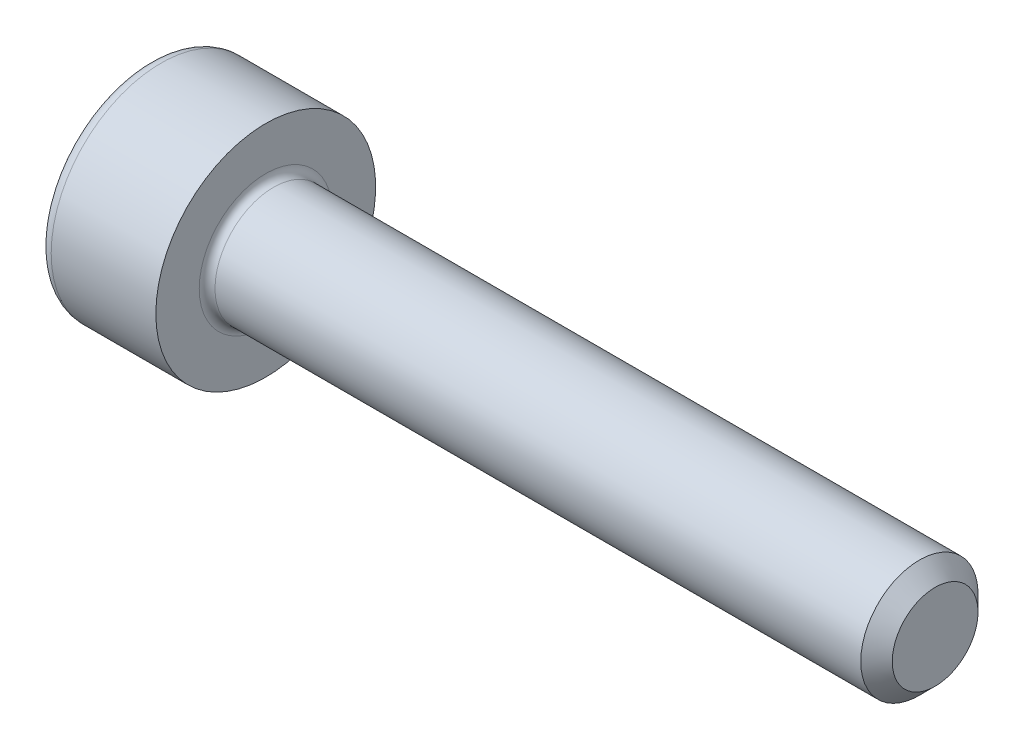
ISO-10303-21;
HEADER;
FILE_DESCRIPTION(('STEP AP214'),'2;1');
FILE_NAME('part.step','',(''),(''),'','','');
FILE_SCHEMA(('AUTOMOTIVE_DESIGN { 1 0 10303 214 1 1 1 1 }'));
ENDSEC;
DATA;
#1=APPLICATION_CONTEXT('core data for automotive mechanical design processes');
#2=APPLICATION_PROTOCOL_DEFINITION('international standard','automotive_design',2000,#1);
#3=PRODUCT_CONTEXT('',#1,'mechanical');
#4=PRODUCT('Part','Part','',(#3));
#5=PRODUCT_RELATED_PRODUCT_CATEGORY('part','',(#4));
#6=PRODUCT_DEFINITION_FORMATION('','',#4);
#7=PRODUCT_DEFINITION_CONTEXT('part definition',#1,'design');
#8=PRODUCT_DEFINITION('design','',#6,#7);
#9=PRODUCT_DEFINITION_SHAPE('','',#8);
#10=(LENGTH_UNIT() NAMED_UNIT(*) SI_UNIT(.MILLI.,.METRE.));
#11=(NAMED_UNIT(*) PLANE_ANGLE_UNIT() SI_UNIT($,.RADIAN.));
#12=(NAMED_UNIT(*) SI_UNIT($,.STERADIAN.) SOLID_ANGLE_UNIT());
#13=UNCERTAINTY_MEASURE_WITH_UNIT(LENGTH_MEASURE(1.E-05),#10,'distance_accuracy_value','');
#14=(GEOMETRIC_REPRESENTATION_CONTEXT(3) GLOBAL_UNCERTAINTY_ASSIGNED_CONTEXT((#13)) GLOBAL_UNIT_ASSIGNED_CONTEXT((#10,
#11,#12)) REPRESENTATION_CONTEXT('',''));
#15=CARTESIAN_POINT('',(0.,0.,0.));
#16=DIRECTION('',(0.,0.,1.));
#17=DIRECTION('',(1.,0.,0.));
#18=AXIS2_PLACEMENT_3D('',#15,#16,#17);
#19=CARTESIAN_POINT('',(0.,0.,0.));
#20=DIRECTION('',(-1.,0.,0.));
#21=DIRECTION('',(0.,0.,1.));
#22=AXIS2_PLACEMENT_3D('',#19,#20,#21);
#23=CYLINDRICAL_SURFACE('',#22,1.39568824458778);
#24=CARTESIAN_POINT('',(0.16,0.,0.));
#25=DIRECTION('',(1.,0.,0.));
#26=DIRECTION('',(0.,0.,-1.));
#27=AXIS2_PLACEMENT_3D('',#24,#25,#26);
#28=CIRCLE('',#27,1.39568824458778);
#29=CARTESIAN_POINT('',(0.16,0.,-1.39568824458778));
#30=VERTEX_POINT('',#29);
#31=EDGE_CURVE('E158',#30,#30,#28,.T.);
#32=ORIENTED_EDGE('',*,*,#31,.T.);
#33=EDGE_LOOP('',(#32));
#34=FACE_BOUND('',#33,.T.);
#35=CARTESIAN_POINT('',(1.48873412756029,0.,0.));
#36=DIRECTION('',(-1.,0.,0.));
#37=DIRECTION('',(0.,0.,1.));
#38=AXIS2_PLACEMENT_3D('',#35,#36,#37);
#39=CIRCLE('',#38,1.39568824458778);
#40=CARTESIAN_POINT('',(1.48873412756029,0.,1.39568824458778));
#41=VERTEX_POINT('',#40);
#42=EDGE_CURVE('E141',#41,#41,#39,.T.);
#43=ORIENTED_EDGE('',*,*,#42,.T.);
#44=EDGE_LOOP('',(#43));
#45=FACE_BOUND('',#44,.T.);
#46=ADVANCED_FACE('F39',(#34,#45),#23,.T.);
#47=CARTESIAN_POINT('',(0.,0.,0.));
#48=DIRECTION('',(1.,0.,0.));
#49=DIRECTION('',(0.,0.,-1.));
#50=AXIS2_PLACEMENT_3D('',#47,#48,#49);
#51=PLANE('',#50);
#52=DIRECTION('',(0.,-0.5,-0.866025403784439));
#53=VECTOR('',#52,1.);
#54=CARTESIAN_POINT('',(0.,0.877572409168232,0.));
#55=LINE('',#54,#53);
#56=CARTESIAN_POINT('',(0.,0.877572409168232,0.));
#57=VERTEX_POINT('',#56);
#58=CARTESIAN_POINT('',(0.,0.438786204584116,-0.760000000000001));
#59=VERTEX_POINT('',#58);
#60=EDGE_CURVE('E128',#57,#59,#55,.T.);
#61=ORIENTED_EDGE('',*,*,#60,.F.);
#62=DIRECTION('',(0.,0.5,-0.866025403784439));
#63=VECTOR('',#62,1.);
#64=CARTESIAN_POINT('',(0.,0.438786204584116,0.76));
#65=LINE('',#64,#63);
#66=CARTESIAN_POINT('',(0.,0.438786204584116,0.76));
#67=VERTEX_POINT('',#66);
#68=EDGE_CURVE('E54',#67,#57,#65,.T.);
#69=ORIENTED_EDGE('',*,*,#68,.F.);
#70=DIRECTION('',(0.,1.,0.));
#71=VECTOR('',#70,1.);
#72=CARTESIAN_POINT('',(0.,-0.438786204584116,0.76));
#73=LINE('',#72,#71);
#74=CARTESIAN_POINT('',(0.,-0.438786204584116,0.76));
#75=VERTEX_POINT('',#74);
#76=EDGE_CURVE('E137',#75,#67,#73,.T.);
#77=ORIENTED_EDGE('',*,*,#76,.F.);
#78=DIRECTION('',(0.,0.5,0.866025403784439));
#79=VECTOR('',#78,1.);
#80=CARTESIAN_POINT('',(0.,-0.877572409168232,0.));
#81=LINE('',#80,#79);
#82=CARTESIAN_POINT('',(0.,-0.877572409168232,0.));
#83=VERTEX_POINT('',#82);
#84=EDGE_CURVE('E135',#83,#75,#81,.T.);
#85=ORIENTED_EDGE('',*,*,#84,.F.);
#86=DIRECTION('',(0.,-0.5,0.866025403784438));
#87=VECTOR('',#86,1.);
#88=CARTESIAN_POINT('',(0.,-0.438786204584116,-0.760000000000001));
#89=LINE('',#88,#87);
#90=CARTESIAN_POINT('',(0.,-0.438786204584116,-0.760000000000001));
#91=VERTEX_POINT('',#90);
#92=EDGE_CURVE('E102',#91,#83,#89,.T.);
#93=ORIENTED_EDGE('',*,*,#92,.F.);
#94=DIRECTION('',(0.,-1.,0.));
#95=VECTOR('',#94,1.);
#96=CARTESIAN_POINT('',(0.,0.438786204584116,-0.760000000000001));
#97=LINE('',#96,#95);
#98=EDGE_CURVE('E131',#59,#91,#97,.T.);
#99=ORIENTED_EDGE('',*,*,#98,.F.);
#100=EDGE_LOOP('',(#61,#69,#77,#85,#93,#99));
#101=FACE_BOUND('',#100,.T.);
#102=CARTESIAN_POINT('',(0.,0.,0.));
#103=DIRECTION('',(1.,0.,0.));
#104=DIRECTION('',(0.,0.,-1.));
#105=AXIS2_PLACEMENT_3D('',#102,#103,#104);
#106=CIRCLE('',#105,1.23568824458778);
#107=CARTESIAN_POINT('',(0.,0.,-1.23568824458778));
#108=VERTEX_POINT('',#107);
#109=EDGE_CURVE('E155',#108,#108,#106,.F.);
#110=ORIENTED_EDGE('',*,*,#109,.T.);
#111=EDGE_LOOP('',(#110));
#112=FACE_BOUND('',#111,.T.);
#113=ADVANCED_FACE('F180',(#101,#112),#51,.F.);
#114=CARTESIAN_POINT('',(9.9887341275603,0.,0.));
#115=DIRECTION('',(-1.,0.,0.));
#116=DIRECTION('',(0.,0.,1.));
#117=AXIS2_PLACEMENT_3D('',#114,#115,#116);
#118=PLANE('',#117);
#119=CARTESIAN_POINT('',(9.9887341275603,0.,0.));
#120=DIRECTION('',(-1.,0.,0.));
#121=DIRECTION('',(0.,0.,1.));
#122=AXIS2_PLACEMENT_3D('',#119,#120,#121);
#123=CIRCLE('',#122,0.544367063780148);
#124=CARTESIAN_POINT('',(9.9887341275603,0.,0.544367063780148));
#125=VERTEX_POINT('',#124);
#126=EDGE_CURVE('E11',#125,#125,#123,.F.);
#127=ORIENTED_EDGE('',*,*,#126,.T.);
#128=EDGE_LOOP('',(#127));
#129=FACE_BOUND('',#128,.T.);
#130=ADVANCED_FACE('F186',(#129),#118,.F.);
#131=CARTESIAN_POINT('',(0.,0.,0.));
#132=DIRECTION('',(-1.,0.,0.));
#133=DIRECTION('',(0.,0.,1.));
#134=AXIS2_PLACEMENT_3D('',#131,#132,#133);
#135=CYLINDRICAL_SURFACE('',#134,0.744367063780147);
#136=CARTESIAN_POINT('',(9.7887341275603,0.,0.));
#137=DIRECTION('',(-1.,0.,0.));
#138=DIRECTION('',(0.,0.,1.));
#139=AXIS2_PLACEMENT_3D('',#136,#137,#138);
#140=CIRCLE('',#139,0.744367063780147);
#141=CARTESIAN_POINT('',(9.7887341275603,0.,0.744367063780147));
#142=VERTEX_POINT('',#141);
#143=EDGE_CURVE('E47',#142,#142,#140,.T.);
#144=ORIENTED_EDGE('',*,*,#143,.T.);
#145=EDGE_LOOP('',(#144));
#146=FACE_BOUND('',#145,.T.);
#147=CARTESIAN_POINT('',(1.58873412756029,0.,0.));
#148=DIRECTION('',(-1.,0.,0.));
#149=DIRECTION('',(0.,0.,1.));
#150=AXIS2_PLACEMENT_3D('',#147,#148,#149);
#151=CIRCLE('',#150,0.744367063780147);
#152=CARTESIAN_POINT('',(1.58873412756029,0.,0.744367063780147));
#153=VERTEX_POINT('',#152);
#154=EDGE_CURVE('E152',#153,#153,#151,.F.);
#155=ORIENTED_EDGE('',*,*,#154,.T.);
#156=EDGE_LOOP('',(#155));
#157=FACE_BOUND('',#156,.T.);
#158=ADVANCED_FACE('F163',(#146,#157),#135,.T.);
#159=CARTESIAN_POINT('',(1.48873412756029,0.,0.));
#160=DIRECTION('',(-1.,0.,0.));
#161=DIRECTION('',(0.,0.,1.));
#162=AXIS2_PLACEMENT_3D('',#159,#160,#161);
#163=PLANE('',#162);
#164=CARTESIAN_POINT('',(1.48873412756029,0.,0.));
#165=DIRECTION('',(-1.,0.,0.));
#166=DIRECTION('',(0.,0.,1.));
#167=AXIS2_PLACEMENT_3D('',#164,#165,#166);
#168=CIRCLE('',#167,0.844367063780147);
#169=CARTESIAN_POINT('',(1.48873412756029,0.,0.844367063780147));
#170=VERTEX_POINT('',#169);
#171=EDGE_CURVE('E149',#170,#170,#168,.T.);
#172=ORIENTED_EDGE('',*,*,#171,.T.);
#173=EDGE_LOOP('',(#172));
#174=FACE_BOUND('',#173,.T.);
#175=ORIENTED_EDGE('',*,*,#42,.F.);
#176=EDGE_LOOP('',(#175));
#177=FACE_BOUND('',#176,.T.);
#178=ADVANCED_FACE('F193',(#174,#177),#163,.F.);
#179=CARTESIAN_POINT('',(1.58873412756029,0.,0.));
#180=DIRECTION('',(-1.,0.,0.));
#181=DIRECTION('',(0.,0.,1.));
#182=AXIS2_PLACEMENT_3D('',#179,#180,#181);
#183=TOROIDAL_SURFACE('',#182,0.844367063780147,0.1);
#184=ORIENTED_EDGE('',*,*,#154,.F.);
#185=EDGE_LOOP('',(#184));
#186=FACE_BOUND('',#185,.T.);
#187=ORIENTED_EDGE('',*,*,#171,.F.);
#188=EDGE_LOOP('',(#187));
#189=FACE_BOUND('',#188,.T.);
#190=ADVANCED_FACE('F176',(#186,#189),#183,.F.);
#191=CARTESIAN_POINT('',(0.16,0.,0.));
#192=DIRECTION('',(1.,0.,0.));
#193=DIRECTION('',(0.,0.,-1.));
#194=AXIS2_PLACEMENT_3D('',#191,#192,#193);
#195=TOROIDAL_SURFACE('',#194,1.23568824458778,0.16);
#196=ORIENTED_EDGE('',*,*,#31,.F.);
#197=EDGE_LOOP('',(#196));
#198=FACE_BOUND('',#197,.T.);
#199=ORIENTED_EDGE('',*,*,#109,.F.);
#200=EDGE_LOOP('',(#199));
#201=FACE_BOUND('',#200,.T.);
#202=ADVANCED_FACE('F168',(#198,#201),#195,.T.);
#203=CARTESIAN_POINT('',(9.7887341275603,0.,0.));
#204=DIRECTION('',(-1.,0.,0.));
#205=DIRECTION('',(0.,0.,1.));
#206=AXIS2_PLACEMENT_3D('',#203,#204,#205);
#207=CONICAL_SURFACE('',#206,0.744367063780147,0.785398163397449);
#208=ORIENTED_EDGE('',*,*,#126,.F.);
#209=EDGE_LOOP('',(#208));
#210=FACE_BOUND('',#209,.T.);
#211=ORIENTED_EDGE('',*,*,#143,.F.);
#212=EDGE_LOOP('',(#211));
#213=FACE_BOUND('',#212,.T.);
#214=ADVANCED_FACE('F41',(#210,#213),#207,.T.);
#215=CARTESIAN_POINT('',(0.7,0.438786204584116,0.76));
#216=DIRECTION('',(0.,0.866025403784439,0.5));
#217=DIRECTION('',(0.,-0.5,0.866025403784439));
#218=AXIS2_PLACEMENT_3D('',#215,#216,#217);
#219=PLANE('',#218);
#220=ORIENTED_EDGE('',*,*,#68,.T.);
#221=DIRECTION('',(-1.,0.,0.));
#222=VECTOR('',#221,1.);
#223=CARTESIAN_POINT('',(0.7,0.877572409168232,0.));
#224=LINE('',#223,#222);
#225=CARTESIAN_POINT('',(0.7,0.877572409168232,0.));
#226=VERTEX_POINT('',#225);
#227=EDGE_CURVE('E84',#226,#57,#224,.T.);
#228=ORIENTED_EDGE('',*,*,#227,.F.);
#229=DIRECTION('',(0.,0.5,-0.866025403784439));
#230=VECTOR('',#229,1.);
#231=CARTESIAN_POINT('',(0.7,0.438786204584116,0.76));
#232=LINE('',#231,#230);
#233=CARTESIAN_POINT('',(0.7,0.438786204584116,0.76));
#234=VERTEX_POINT('',#233);
#235=EDGE_CURVE('E139',#234,#226,#232,.T.);
#236=ORIENTED_EDGE('',*,*,#235,.F.);
#237=DIRECTION('',(-1.,0.,0.));
#238=VECTOR('',#237,1.);
#239=CARTESIAN_POINT('',(0.7,0.438786204584116,0.76));
#240=LINE('',#239,#238);
#241=EDGE_CURVE('E62',#234,#67,#240,.T.);
#242=ORIENTED_EDGE('',*,*,#241,.T.);
#243=EDGE_LOOP('',(#220,#228,#236,#242));
#244=FACE_BOUND('',#243,.T.);
#245=ADVANCED_FACE('F167',(#244),#219,.F.);
#246=CARTESIAN_POINT('',(0.7,-0.438786204584116,0.76));
#247=DIRECTION('',(0.,0.,1.));
#248=DIRECTION('',(1.,0.,0.));
#249=AXIS2_PLACEMENT_3D('',#246,#247,#248);
#250=PLANE('',#249);
#251=ORIENTED_EDGE('',*,*,#76,.T.);
#252=ORIENTED_EDGE('',*,*,#241,.F.);
#253=DIRECTION('',(0.,1.,0.));
#254=VECTOR('',#253,1.);
#255=CARTESIAN_POINT('',(0.7,-0.438786204584116,0.76));
#256=LINE('',#255,#254);
#257=CARTESIAN_POINT('',(0.7,-0.438786204584116,0.76));
#258=VERTEX_POINT('',#257);
#259=EDGE_CURVE('E114',#258,#234,#256,.T.);
#260=ORIENTED_EDGE('',*,*,#259,.F.);
#261=DIRECTION('',(-1.,0.,0.));
#262=VECTOR('',#261,1.);
#263=CARTESIAN_POINT('',(0.7,-0.438786204584116,0.76));
#264=LINE('',#263,#262);
#265=EDGE_CURVE('E106',#258,#75,#264,.T.);
#266=ORIENTED_EDGE('',*,*,#265,.T.);
#267=EDGE_LOOP('',(#251,#252,#260,#266));
#268=FACE_BOUND('',#267,.T.);
#269=ADVANCED_FACE('F174',(#268),#250,.F.);
#270=CARTESIAN_POINT('',(0.7,-0.877572409168232,0.));
#271=DIRECTION('',(0.,-0.866025403784439,0.5));
#272=DIRECTION('',(0.,-0.5,-0.866025403784439));
#273=AXIS2_PLACEMENT_3D('',#270,#271,#272);
#274=PLANE('',#273);
#275=ORIENTED_EDGE('',*,*,#84,.T.);
#276=ORIENTED_EDGE('',*,*,#265,.F.);
#277=DIRECTION('',(0.,0.5,0.866025403784439));
#278=VECTOR('',#277,1.);
#279=CARTESIAN_POINT('',(0.7,-0.877572409168232,0.));
#280=LINE('',#279,#278);
#281=CARTESIAN_POINT('',(0.7,-0.877572409168232,0.));
#282=VERTEX_POINT('',#281);
#283=EDGE_CURVE('E110',#282,#258,#280,.T.);
#284=ORIENTED_EDGE('',*,*,#283,.F.);
#285=DIRECTION('',(-1.,0.,0.));
#286=VECTOR('',#285,1.);
#287=CARTESIAN_POINT('',(0.7,-0.877572409168232,0.));
#288=LINE('',#287,#286);
#289=EDGE_CURVE('E95',#282,#83,#288,.T.);
#290=ORIENTED_EDGE('',*,*,#289,.T.);
#291=EDGE_LOOP('',(#275,#276,#284,#290));
#292=FACE_BOUND('',#291,.T.);
#293=ADVANCED_FACE('F111',(#292),#274,.F.);
#294=CARTESIAN_POINT('',(0.7,-0.438786204584116,-0.760000000000001));
#295=DIRECTION('',(0.,-0.866025403784438,-0.5));
#296=DIRECTION('',(0.,0.5,-0.866025403784438));
#297=AXIS2_PLACEMENT_3D('',#294,#295,#296);
#298=PLANE('',#297);
#299=ORIENTED_EDGE('',*,*,#92,.T.);
#300=ORIENTED_EDGE('',*,*,#289,.F.);
#301=DIRECTION('',(0.,-0.5,0.866025403784438));
#302=VECTOR('',#301,1.);
#303=CARTESIAN_POINT('',(0.7,-0.438786204584116,-0.760000000000001));
#304=LINE('',#303,#302);
#305=CARTESIAN_POINT('',(0.7,-0.438786204584116,-0.760000000000001));
#306=VERTEX_POINT('',#305);
#307=EDGE_CURVE('E99',#306,#282,#304,.T.);
#308=ORIENTED_EDGE('',*,*,#307,.F.);
#309=DIRECTION('',(-1.,0.,0.));
#310=VECTOR('',#309,1.);
#311=CARTESIAN_POINT('',(0.7,-0.438786204584116,-0.760000000000001));
#312=LINE('',#311,#310);
#313=EDGE_CURVE('E107',#306,#91,#312,.T.);
#314=ORIENTED_EDGE('',*,*,#313,.T.);
#315=EDGE_LOOP('',(#299,#300,#308,#314));
#316=FACE_BOUND('',#315,.T.);
#317=ADVANCED_FACE('F97',(#316),#298,.F.);
#318=CARTESIAN_POINT('',(0.7,0.438786204584116,-0.760000000000001));
#319=DIRECTION('',(0.,0.,-1.));
#320=DIRECTION('',(0.,1.,0.));
#321=AXIS2_PLACEMENT_3D('',#318,#319,#320);
#322=PLANE('',#321);
#323=ORIENTED_EDGE('',*,*,#98,.T.);
#324=ORIENTED_EDGE('',*,*,#313,.F.);
#325=DIRECTION('',(0.,-1.,0.));
#326=VECTOR('',#325,1.);
#327=CARTESIAN_POINT('',(0.7,0.438786204584116,-0.760000000000001));
#328=LINE('',#327,#326);
#329=CARTESIAN_POINT('',(0.7,0.438786204584116,-0.760000000000001));
#330=VERTEX_POINT('',#329);
#331=EDGE_CURVE('E120',#330,#306,#328,.T.);
#332=ORIENTED_EDGE('',*,*,#331,.F.);
#333=DIRECTION('',(-1.,0.,0.));
#334=VECTOR('',#333,1.);
#335=CARTESIAN_POINT('',(0.7,0.438786204584116,-0.760000000000001));
#336=LINE('',#335,#334);
#337=EDGE_CURVE('E144',#330,#59,#336,.T.);
#338=ORIENTED_EDGE('',*,*,#337,.T.);
#339=EDGE_LOOP('',(#323,#324,#332,#338));
#340=FACE_BOUND('',#339,.T.);
#341=ADVANCED_FACE('F215',(#340),#322,.F.);
#342=CARTESIAN_POINT('',(0.7,0.877572409168232,0.));
#343=DIRECTION('',(0.,0.866025403784439,-0.5));
#344=DIRECTION('',(0.,0.5,0.866025403784439));
#345=AXIS2_PLACEMENT_3D('',#342,#343,#344);
#346=PLANE('',#345);
#347=ORIENTED_EDGE('',*,*,#60,.T.);
#348=ORIENTED_EDGE('',*,*,#337,.F.);
#349=DIRECTION('',(0.,-0.5,-0.866025403784439));
#350=VECTOR('',#349,1.);
#351=CARTESIAN_POINT('',(0.7,0.877572409168232,0.));
#352=LINE('',#351,#350);
#353=EDGE_CURVE('E122',#226,#330,#352,.T.);
#354=ORIENTED_EDGE('',*,*,#353,.F.);
#355=ORIENTED_EDGE('',*,*,#227,.T.);
#356=EDGE_LOOP('',(#347,#348,#354,#355));
#357=FACE_BOUND('',#356,.T.);
#358=ADVANCED_FACE('F212',(#357),#346,.F.);
#359=CARTESIAN_POINT('',(0.7,0.,0.));
#360=DIRECTION('',(-1.,0.,0.));
#361=DIRECTION('',(0.,0.,1.));
#362=AXIS2_PLACEMENT_3D('',#359,#360,#361);
#363=PLANE('',#362);
#364=ORIENTED_EDGE('',*,*,#235,.T.);
#365=ORIENTED_EDGE('',*,*,#353,.T.);
#366=ORIENTED_EDGE('',*,*,#331,.T.);
#367=ORIENTED_EDGE('',*,*,#307,.T.);
#368=ORIENTED_EDGE('',*,*,#283,.T.);
#369=ORIENTED_EDGE('',*,*,#259,.T.);
#370=EDGE_LOOP('',(#364,#365,#366,#367,#368,#369));
#371=FACE_BOUND('',#370,.T.);
#372=ADVANCED_FACE('F117',(#371),#363,.T.);
#373=CLOSED_SHELL('',(#46,#113,#130,#158,#178,#190,#202,#214,#245,#269,#293,#317,#341,#358,#372));
#374=MANIFOLD_SOLID_BREP('B2',#373);
#375=ADVANCED_BREP_SHAPE_REPRESENTATION('',(#18,#374),#14);
#376=SHAPE_DEFINITION_REPRESENTATION(#9,#375);
ENDSEC;
END-ISO-10303-21;
